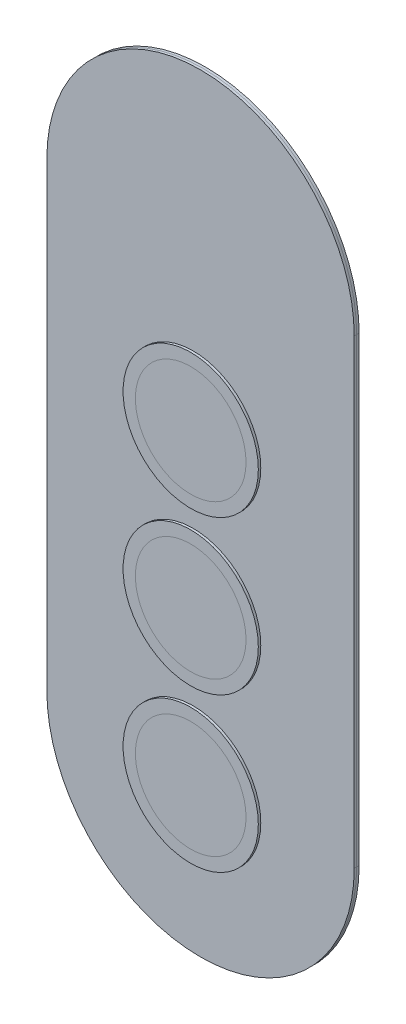
ISO-10303-21;
HEADER;
FILE_DESCRIPTION(('STEP AP214'),'2;1');
FILE_NAME('part.step','',(''),(''),'','','');
FILE_SCHEMA(('AUTOMOTIVE_DESIGN { 1 0 10303 214 1 1 1 1 }'));
ENDSEC;
DATA;
#1=APPLICATION_CONTEXT('core data for automotive mechanical design processes');
#2=APPLICATION_PROTOCOL_DEFINITION('international standard','automotive_design',2000,#1);
#3=PRODUCT_CONTEXT('',#1,'mechanical');
#4=PRODUCT('Part','Part','',(#3));
#5=PRODUCT_RELATED_PRODUCT_CATEGORY('part','',(#4));
#6=PRODUCT_DEFINITION_FORMATION('','',#4);
#7=PRODUCT_DEFINITION_CONTEXT('part definition',#1,'design');
#8=PRODUCT_DEFINITION('design','',#6,#7);
#9=PRODUCT_DEFINITION_SHAPE('','',#8);
#10=(LENGTH_UNIT() NAMED_UNIT(*) SI_UNIT(.MILLI.,.METRE.));
#11=(NAMED_UNIT(*) PLANE_ANGLE_UNIT() SI_UNIT($,.RADIAN.));
#12=(NAMED_UNIT(*) SI_UNIT($,.STERADIAN.) SOLID_ANGLE_UNIT());
#13=UNCERTAINTY_MEASURE_WITH_UNIT(LENGTH_MEASURE(1.E-05),#10,'distance_accuracy_value','');
#14=(GEOMETRIC_REPRESENTATION_CONTEXT(3) GLOBAL_UNCERTAINTY_ASSIGNED_CONTEXT((#13)) GLOBAL_UNIT_ASSIGNED_CONTEXT((#10,
#11,#12)) REPRESENTATION_CONTEXT('',''));
#15=CARTESIAN_POINT('',(0.,0.,0.));
#16=DIRECTION('',(0.,0.,1.));
#17=DIRECTION('',(1.,0.,0.));
#18=AXIS2_PLACEMENT_3D('',#15,#16,#17);
#19=CARTESIAN_POINT('',(0.,-93.75,2.));
#20=DIRECTION('',(0.,0.,-1.));
#21=DIRECTION('',(-1.,0.,0.));
#22=AXIS2_PLACEMENT_3D('',#19,#20,#21);
#23=CYLINDRICAL_SURFACE('',#22,62.5);
#24=CARTESIAN_POINT('',(0.,-93.75,1.));
#25=DIRECTION('',(0.,0.,1.));
#26=DIRECTION('',(1.,0.,0.));
#27=AXIS2_PLACEMENT_3D('',#24,#25,#26);
#28=CIRCLE('',#27,62.5);
#29=CARTESIAN_POINT('',(-62.5,-93.75,1.));
#30=VERTEX_POINT('',#29);
#31=CARTESIAN_POINT('',(62.5,-93.75,1.));
#32=VERTEX_POINT('',#31);
#33=EDGE_CURVE('E109',#30,#32,#28,.T.);
#34=ORIENTED_EDGE('',*,*,#33,.T.);
#35=DIRECTION('',(0.,0.,-1.));
#36=VECTOR('',#35,1.);
#37=CARTESIAN_POINT('',(62.5,-93.75,2.));
#38=LINE('',#37,#36);
#39=CARTESIAN_POINT('',(62.5,-93.75,2.));
#40=VERTEX_POINT('',#39);
#41=EDGE_CURVE('E12',#40,#32,#38,.T.);
#42=ORIENTED_EDGE('',*,*,#41,.F.);
#43=CARTESIAN_POINT('',(0.,-93.75,2.));
#44=DIRECTION('',(0.,0.,1.));
#45=DIRECTION('',(1.,0.,0.));
#46=AXIS2_PLACEMENT_3D('',#43,#44,#45);
#47=CIRCLE('',#46,62.5);
#48=CARTESIAN_POINT('',(-62.5,-93.75,2.));
#49=VERTEX_POINT('',#48);
#50=EDGE_CURVE('E97',#49,#40,#47,.T.);
#51=ORIENTED_EDGE('',*,*,#50,.F.);
#52=DIRECTION('',(0.,0.,-1.));
#53=VECTOR('',#52,1.);
#54=CARTESIAN_POINT('',(-62.5,-93.75,2.));
#55=LINE('',#54,#53);
#56=EDGE_CURVE('E105',#49,#30,#55,.T.);
#57=ORIENTED_EDGE('',*,*,#56,.T.);
#58=EDGE_LOOP('',(#34,#42,#51,#57));
#59=FACE_BOUND('',#58,.T.);
#60=ADVANCED_FACE('F46',(#59),#23,.T.);
#61=CARTESIAN_POINT('',(62.5,-93.75,2.));
#62=DIRECTION('',(-1.,0.,0.));
#63=DIRECTION('',(0.,0.,1.));
#64=AXIS2_PLACEMENT_3D('',#61,#62,#63);
#65=PLANE('',#64);
#66=DIRECTION('',(0.,1.,0.));
#67=VECTOR('',#66,1.);
#68=CARTESIAN_POINT('',(62.5,-93.75,1.));
#69=LINE('',#68,#67);
#70=CARTESIAN_POINT('',(62.5,93.75,1.));
#71=VERTEX_POINT('',#70);
#72=EDGE_CURVE('E101',#32,#71,#69,.T.);
#73=ORIENTED_EDGE('',*,*,#72,.T.);
#74=DIRECTION('',(0.,0.,-1.));
#75=VECTOR('',#74,1.);
#76=CARTESIAN_POINT('',(62.5,93.75,2.));
#77=LINE('',#76,#75);
#78=CARTESIAN_POINT('',(62.5,93.75,2.));
#79=VERTEX_POINT('',#78);
#80=EDGE_CURVE('E54',#79,#71,#77,.T.);
#81=ORIENTED_EDGE('',*,*,#80,.F.);
#82=DIRECTION('',(0.,1.,0.));
#83=VECTOR('',#82,1.);
#84=CARTESIAN_POINT('',(62.5,-93.75,2.));
#85=LINE('',#84,#83);
#86=EDGE_CURVE('E92',#40,#79,#85,.T.);
#87=ORIENTED_EDGE('',*,*,#86,.F.);
#88=ORIENTED_EDGE('',*,*,#41,.T.);
#89=EDGE_LOOP('',(#73,#81,#87,#88));
#90=FACE_BOUND('',#89,.T.);
#91=ADVANCED_FACE('F100',(#90),#65,.F.);
#92=CARTESIAN_POINT('',(0.,93.75,2.));
#93=DIRECTION('',(0.,0.,-1.));
#94=DIRECTION('',(-1.,0.,0.));
#95=AXIS2_PLACEMENT_3D('',#92,#93,#94);
#96=CYLINDRICAL_SURFACE('',#95,62.5);
#97=CARTESIAN_POINT('',(0.,93.75,1.));
#98=DIRECTION('',(0.,0.,1.));
#99=DIRECTION('',(1.,0.,0.));
#100=AXIS2_PLACEMENT_3D('',#97,#98,#99);
#101=CIRCLE('',#100,62.5);
#102=CARTESIAN_POINT('',(-62.5,93.75,1.));
#103=VERTEX_POINT('',#102);
#104=EDGE_CURVE('E79',#71,#103,#101,.T.);
#105=ORIENTED_EDGE('',*,*,#104,.T.);
#106=DIRECTION('',(0.,0.,-1.));
#107=VECTOR('',#106,1.);
#108=CARTESIAN_POINT('',(-62.5,93.75,2.));
#109=LINE('',#108,#107);
#110=CARTESIAN_POINT('',(-62.5,93.75,2.));
#111=VERTEX_POINT('',#110);
#112=EDGE_CURVE('E102',#111,#103,#109,.T.);
#113=ORIENTED_EDGE('',*,*,#112,.F.);
#114=CARTESIAN_POINT('',(0.,93.75,2.));
#115=DIRECTION('',(0.,0.,1.));
#116=DIRECTION('',(1.,0.,0.));
#117=AXIS2_PLACEMENT_3D('',#114,#115,#116);
#118=CIRCLE('',#117,62.5);
#119=EDGE_CURVE('E95',#79,#111,#118,.T.);
#120=ORIENTED_EDGE('',*,*,#119,.F.);
#121=ORIENTED_EDGE('',*,*,#80,.T.);
#122=EDGE_LOOP('',(#105,#113,#120,#121));
#123=FACE_BOUND('',#122,.T.);
#124=ADVANCED_FACE('F103',(#123),#96,.T.);
#125=CARTESIAN_POINT('',(-62.5,93.75,2.));
#126=DIRECTION('',(1.,0.,0.));
#127=DIRECTION('',(0.,1.,0.));
#128=AXIS2_PLACEMENT_3D('',#125,#126,#127);
#129=PLANE('',#128);
#130=DIRECTION('',(0.,-1.,0.));
#131=VECTOR('',#130,1.);
#132=CARTESIAN_POINT('',(-62.5,93.75,1.));
#133=LINE('',#132,#131);
#134=EDGE_CURVE('E85',#103,#30,#133,.T.);
#135=ORIENTED_EDGE('',*,*,#134,.T.);
#136=ORIENTED_EDGE('',*,*,#56,.F.);
#137=DIRECTION('',(0.,-1.,0.));
#138=VECTOR('',#137,1.);
#139=CARTESIAN_POINT('',(-62.5,93.75,2.));
#140=LINE('',#139,#138);
#141=EDGE_CURVE('E62',#111,#49,#140,.T.);
#142=ORIENTED_EDGE('',*,*,#141,.F.);
#143=ORIENTED_EDGE('',*,*,#112,.T.);
#144=EDGE_LOOP('',(#135,#136,#142,#143));
#145=FACE_BOUND('',#144,.T.);
#146=ADVANCED_FACE('F116',(#145),#129,.F.);
#147=CARTESIAN_POINT('',(0.,-93.75,2.));
#148=DIRECTION('',(0.,0.,1.));
#149=DIRECTION('',(1.,0.,0.));
#150=AXIS2_PLACEMENT_3D('',#147,#148,#149);
#151=PLANE('',#150);
#152=ORIENTED_EDGE('',*,*,#50,.T.);
#153=ORIENTED_EDGE('',*,*,#86,.T.);
#154=ORIENTED_EDGE('',*,*,#119,.T.);
#155=ORIENTED_EDGE('',*,*,#141,.T.);
#156=EDGE_LOOP('',(#152,#153,#154,#155));
#157=FACE_BOUND('',#156,.T.);
#158=ADVANCED_FACE('F93',(#157),#151,.T.);
#159=CARTESIAN_POINT('',(0.,-93.75,1.));
#160=DIRECTION('',(0.,0.,1.));
#161=DIRECTION('',(1.,0.,0.));
#162=AXIS2_PLACEMENT_3D('',#159,#160,#161);
#163=PLANE('',#162);
#164=ORIENTED_EDGE('',*,*,#33,.F.);
#165=ORIENTED_EDGE('',*,*,#134,.F.);
#166=ORIENTED_EDGE('',*,*,#104,.F.);
#167=ORIENTED_EDGE('',*,*,#72,.F.);
#168=EDGE_LOOP('',(#164,#165,#166,#167));
#169=FACE_BOUND('',#168,.T.);
#170=ADVANCED_FACE('F119',(#169),#163,.F.);
#171=CLOSED_SHELL('',(#60,#91,#124,#146,#158,#170));
#172=MANIFOLD_SOLID_BREP('B2',#171);
#173=CARTESIAN_POINT('',(0.,31.25,6.));
#174=DIRECTION('',(0.,0.,-1.));
#175=DIRECTION('',(-1.,0.,0.));
#176=AXIS2_PLACEMENT_3D('',#173,#174,#175);
#177=CYLINDRICAL_SURFACE('',#176,22.5);
#178=CARTESIAN_POINT('',(0.,31.25,6.));
#179=DIRECTION('',(0.,0.,1.));
#180=DIRECTION('',(1.,0.,0.));
#181=AXIS2_PLACEMENT_3D('',#178,#179,#180);
#182=CIRCLE('',#181,22.5);
#183=CARTESIAN_POINT('',(22.5,31.25,6.));
#184=VERTEX_POINT('',#183);
#185=EDGE_CURVE('E45',#184,#184,#182,.T.);
#186=ORIENTED_EDGE('',*,*,#185,.F.);
#187=EDGE_LOOP('',(#186));
#188=FACE_BOUND('',#187,.T.);
#189=CARTESIAN_POINT('',(0.,31.25,5.));
#190=DIRECTION('',(0.,0.,1.));
#191=DIRECTION('',(1.,0.,0.));
#192=AXIS2_PLACEMENT_3D('',#189,#190,#191);
#193=CIRCLE('',#192,22.5);
#194=CARTESIAN_POINT('',(22.5,31.25,5.));
#195=VERTEX_POINT('',#194);
#196=EDGE_CURVE('E181',#195,#195,#193,.T.);
#197=ORIENTED_EDGE('',*,*,#196,.T.);
#198=EDGE_LOOP('',(#197));
#199=FACE_BOUND('',#198,.T.);
#200=ADVANCED_FACE('F178',(#188,#199),#177,.T.);
#201=CARTESIAN_POINT('',(0.,31.25,6.));
#202=DIRECTION('',(0.,0.,1.));
#203=DIRECTION('',(1.,0.,0.));
#204=AXIS2_PLACEMENT_3D('',#201,#202,#203);
#205=PLANE('',#204);
#206=ORIENTED_EDGE('',*,*,#185,.T.);
#207=EDGE_LOOP('',(#206));
#208=FACE_BOUND('',#207,.T.);
#209=ADVANCED_FACE('F193',(#208),#205,.T.);
#210=CARTESIAN_POINT('',(0.,31.25,5.));
#211=DIRECTION('',(0.,0.,1.));
#212=DIRECTION('',(1.,0.,0.));
#213=AXIS2_PLACEMENT_3D('',#210,#211,#212);
#214=PLANE('',#213);
#215=ORIENTED_EDGE('',*,*,#196,.F.);
#216=EDGE_LOOP('',(#215));
#217=FACE_BOUND('',#216,.T.);
#218=ADVANCED_FACE('F191',(#217),#214,.F.);
#219=CLOSED_SHELL('',(#200,#209,#218));
#220=MANIFOLD_SOLID_BREP('B6_NOT_SHOWN',#219);
#221=CARTESIAN_POINT('',(0.,-31.25,6.));
#222=DIRECTION('',(0.,0.,-1.));
#223=DIRECTION('',(-1.,0.,0.));
#224=AXIS2_PLACEMENT_3D('',#221,#222,#223);
#225=CYLINDRICAL_SURFACE('',#224,22.5);
#226=CARTESIAN_POINT('',(0.,-31.25,6.));
#227=DIRECTION('',(0.,0.,1.));
#228=DIRECTION('',(1.,0.,0.));
#229=AXIS2_PLACEMENT_3D('',#226,#227,#228);
#230=CIRCLE('',#229,22.5);
#231=CARTESIAN_POINT('',(22.5,-31.25,6.));
#232=VERTEX_POINT('',#231);
#233=EDGE_CURVE('E177',#232,#232,#230,.T.);
#234=ORIENTED_EDGE('',*,*,#233,.F.);
#235=EDGE_LOOP('',(#234));
#236=FACE_BOUND('',#235,.T.);
#237=CARTESIAN_POINT('',(0.,-31.25,5.));
#238=DIRECTION('',(0.,0.,1.));
#239=DIRECTION('',(1.,0.,0.));
#240=AXIS2_PLACEMENT_3D('',#237,#238,#239);
#241=CIRCLE('',#240,22.5);
#242=CARTESIAN_POINT('',(22.5,-31.25,5.));
#243=VERTEX_POINT('',#242);
#244=EDGE_CURVE('E230',#243,#243,#241,.T.);
#245=ORIENTED_EDGE('',*,*,#244,.T.);
#246=EDGE_LOOP('',(#245));
#247=FACE_BOUND('',#246,.T.);
#248=ADVANCED_FACE('F227',(#236,#247),#225,.T.);
#249=CARTESIAN_POINT('',(0.,-31.25,6.));
#250=DIRECTION('',(0.,0.,1.));
#251=DIRECTION('',(1.,0.,0.));
#252=AXIS2_PLACEMENT_3D('',#249,#250,#251);
#253=PLANE('',#252);
#254=ORIENTED_EDGE('',*,*,#233,.T.);
#255=EDGE_LOOP('',(#254));
#256=FACE_BOUND('',#255,.T.);
#257=ADVANCED_FACE('F242',(#256),#253,.T.);
#258=CARTESIAN_POINT('',(0.,-31.25,5.));
#259=DIRECTION('',(0.,0.,1.));
#260=DIRECTION('',(1.,0.,0.));
#261=AXIS2_PLACEMENT_3D('',#258,#259,#260);
#262=PLANE('',#261);
#263=ORIENTED_EDGE('',*,*,#244,.F.);
#264=EDGE_LOOP('',(#263));
#265=FACE_BOUND('',#264,.T.);
#266=ADVANCED_FACE('F240',(#265),#262,.F.);
#267=CLOSED_SHELL('',(#248,#257,#266));
#268=MANIFOLD_SOLID_BREP('B40_NOT_SHOWN',#267);
#269=CARTESIAN_POINT('',(0.,-93.75,6.));
#270=DIRECTION('',(0.,0.,-1.));
#271=DIRECTION('',(-1.,0.,0.));
#272=AXIS2_PLACEMENT_3D('',#269,#270,#271);
#273=CYLINDRICAL_SURFACE('',#272,22.5);
#274=CARTESIAN_POINT('',(0.,-93.75,6.));
#275=DIRECTION('',(0.,0.,1.));
#276=DIRECTION('',(1.,0.,0.));
#277=AXIS2_PLACEMENT_3D('',#274,#275,#276);
#278=CIRCLE('',#277,22.5);
#279=CARTESIAN_POINT('',(22.5,-93.75,6.));
#280=VERTEX_POINT('',#279);
#281=EDGE_CURVE('E226',#280,#280,#278,.T.);
#282=ORIENTED_EDGE('',*,*,#281,.F.);
#283=EDGE_LOOP('',(#282));
#284=FACE_BOUND('',#283,.T.);
#285=CARTESIAN_POINT('',(0.,-93.75,5.));
#286=DIRECTION('',(0.,0.,1.));
#287=DIRECTION('',(1.,0.,0.));
#288=AXIS2_PLACEMENT_3D('',#285,#286,#287);
#289=CIRCLE('',#288,22.5);
#290=CARTESIAN_POINT('',(22.5,-93.75,5.));
#291=VERTEX_POINT('',#290);
#292=EDGE_CURVE('E279',#291,#291,#289,.T.);
#293=ORIENTED_EDGE('',*,*,#292,.T.);
#294=EDGE_LOOP('',(#293));
#295=FACE_BOUND('',#294,.T.);
#296=ADVANCED_FACE('F276',(#284,#295),#273,.T.);
#297=CARTESIAN_POINT('',(0.,-93.75,6.));
#298=DIRECTION('',(0.,0.,1.));
#299=DIRECTION('',(1.,0.,0.));
#300=AXIS2_PLACEMENT_3D('',#297,#298,#299);
#301=PLANE('',#300);
#302=ORIENTED_EDGE('',*,*,#281,.T.);
#303=EDGE_LOOP('',(#302));
#304=FACE_BOUND('',#303,.T.);
#305=ADVANCED_FACE('F291',(#304),#301,.T.);
#306=CARTESIAN_POINT('',(0.,-93.75,5.));
#307=DIRECTION('',(0.,0.,1.));
#308=DIRECTION('',(1.,0.,0.));
#309=AXIS2_PLACEMENT_3D('',#306,#307,#308);
#310=PLANE('',#309);
#311=ORIENTED_EDGE('',*,*,#292,.F.);
#312=EDGE_LOOP('',(#311));
#313=FACE_BOUND('',#312,.T.);
#314=ADVANCED_FACE('F289',(#313),#310,.F.);
#315=CLOSED_SHELL('',(#296,#305,#314));
#316=MANIFOLD_SOLID_BREP('B172_NOT_SHOWN',#315);
#317=CARTESIAN_POINT('',(0.,-93.75,6.));
#318=DIRECTION('',(0.,0.,1.));
#319=DIRECTION('',(1.,0.,0.));
#320=AXIS2_PLACEMENT_3D('',#317,#318,#319);
#321=PLANE('',#320);
#322=CARTESIAN_POINT('',(0.,-93.75,6.));
#323=DIRECTION('',(0.,0.,1.));
#324=DIRECTION('',(1.,0.,0.));
#325=AXIS2_PLACEMENT_3D('',#322,#323,#324);
#326=CIRCLE('',#325,27.5);
#327=CARTESIAN_POINT('',(27.5,-93.75,6.));
#328=VERTEX_POINT('',#327);
#329=EDGE_CURVE('E275',#328,#328,#326,.T.);
#330=ORIENTED_EDGE('',*,*,#329,.T.);
#331=EDGE_LOOP('',(#330));
#332=FACE_BOUND('',#331,.T.);
#333=CARTESIAN_POINT('',(0.,-93.75,6.));
#334=DIRECTION('',(0.,0.,1.));
#335=DIRECTION('',(1.,0.,0.));
#336=AXIS2_PLACEMENT_3D('',#333,#334,#335);
#337=CIRCLE('',#336,22.5);
#338=CARTESIAN_POINT('',(22.5,-93.75,6.));
#339=VERTEX_POINT('',#338);
#340=EDGE_CURVE('E336',#339,#339,#337,.T.);
#341=ORIENTED_EDGE('',*,*,#340,.F.);
#342=EDGE_LOOP('',(#341));
#343=FACE_BOUND('',#342,.T.);
#344=ADVANCED_FACE('F325',(#332,#343),#321,.T.);
#345=CARTESIAN_POINT('',(0.,-93.75,5.));
#346=DIRECTION('',(0.,0.,1.));
#347=DIRECTION('',(1.,0.,0.));
#348=AXIS2_PLACEMENT_3D('',#345,#346,#347);
#349=PLANE('',#348);
#350=CARTESIAN_POINT('',(0.,-93.75,5.));
#351=DIRECTION('',(0.,0.,1.));
#352=DIRECTION('',(1.,0.,0.));
#353=AXIS2_PLACEMENT_3D('',#350,#351,#352);
#354=CIRCLE('',#353,27.5);
#355=CARTESIAN_POINT('',(27.5,-93.75,5.));
#356=VERTEX_POINT('',#355);
#357=EDGE_CURVE('E329',#356,#356,#354,.T.);
#358=ORIENTED_EDGE('',*,*,#357,.F.);
#359=EDGE_LOOP('',(#358));
#360=FACE_BOUND('',#359,.T.);
#361=CARTESIAN_POINT('',(0.,-93.75,5.));
#362=DIRECTION('',(0.,0.,1.));
#363=DIRECTION('',(1.,0.,0.));
#364=AXIS2_PLACEMENT_3D('',#361,#362,#363);
#365=CIRCLE('',#364,22.5);
#366=CARTESIAN_POINT('',(22.5,-93.75,5.));
#367=VERTEX_POINT('',#366);
#368=EDGE_CURVE('E338',#367,#367,#365,.T.);
#369=ORIENTED_EDGE('',*,*,#368,.T.);
#370=EDGE_LOOP('',(#369));
#371=FACE_BOUND('',#370,.T.);
#372=ADVANCED_FACE('F348',(#360,#371),#349,.F.);
#373=CARTESIAN_POINT('',(0.,-93.75,6.));
#374=DIRECTION('',(0.,0.,-1.));
#375=DIRECTION('',(-1.,0.,0.));
#376=AXIS2_PLACEMENT_3D('',#373,#374,#375);
#377=CYLINDRICAL_SURFACE('',#376,27.5);
#378=ORIENTED_EDGE('',*,*,#329,.F.);
#379=EDGE_LOOP('',(#378));
#380=FACE_BOUND('',#379,.T.);
#381=ORIENTED_EDGE('',*,*,#357,.T.);
#382=EDGE_LOOP('',(#381));
#383=FACE_BOUND('',#382,.T.);
#384=ADVANCED_FACE('F327',(#380,#383),#377,.T.);
#385=CARTESIAN_POINT('',(0.,-93.75,6.));
#386=DIRECTION('',(0.,0.,-1.));
#387=DIRECTION('',(-1.,0.,0.));
#388=AXIS2_PLACEMENT_3D('',#385,#386,#387);
#389=CYLINDRICAL_SURFACE('',#388,22.5);
#390=ORIENTED_EDGE('',*,*,#340,.T.);
#391=EDGE_LOOP('',(#390));
#392=FACE_BOUND('',#391,.T.);
#393=ORIENTED_EDGE('',*,*,#368,.F.);
#394=EDGE_LOOP('',(#393));
#395=FACE_BOUND('',#394,.T.);
#396=ADVANCED_FACE('F344',(#392,#395),#389,.F.);
#397=CLOSED_SHELL('',(#344,#372,#384,#396));
#398=MANIFOLD_SOLID_BREP('B221_NOT_SHOWN',#397);
#399=CARTESIAN_POINT('',(0.,-31.25,6.));
#400=DIRECTION('',(0.,0.,1.));
#401=DIRECTION('',(1.,0.,0.));
#402=AXIS2_PLACEMENT_3D('',#399,#400,#401);
#403=PLANE('',#402);
#404=CARTESIAN_POINT('',(0.,-31.25,6.));
#405=DIRECTION('',(0.,0.,1.));
#406=DIRECTION('',(1.,0.,0.));
#407=AXIS2_PLACEMENT_3D('',#404,#405,#406);
#408=CIRCLE('',#407,27.5);
#409=CARTESIAN_POINT('',(27.5,-31.25,6.));
#410=VERTEX_POINT('',#409);
#411=EDGE_CURVE('E324',#410,#410,#408,.T.);
#412=ORIENTED_EDGE('',*,*,#411,.T.);
#413=EDGE_LOOP('',(#412));
#414=FACE_BOUND('',#413,.T.);
#415=CARTESIAN_POINT('',(0.,-31.25,6.));
#416=DIRECTION('',(0.,0.,1.));
#417=DIRECTION('',(1.,0.,0.));
#418=AXIS2_PLACEMENT_3D('',#415,#416,#417);
#419=CIRCLE('',#418,22.5);
#420=CARTESIAN_POINT('',(22.5,-31.25,6.));
#421=VERTEX_POINT('',#420);
#422=EDGE_CURVE('E406',#421,#421,#419,.T.);
#423=ORIENTED_EDGE('',*,*,#422,.F.);
#424=EDGE_LOOP('',(#423));
#425=FACE_BOUND('',#424,.T.);
#426=ADVANCED_FACE('F395',(#414,#425),#403,.T.);
#427=CARTESIAN_POINT('',(0.,-31.25,5.));
#428=DIRECTION('',(0.,0.,1.));
#429=DIRECTION('',(1.,0.,0.));
#430=AXIS2_PLACEMENT_3D('',#427,#428,#429);
#431=PLANE('',#430);
#432=CARTESIAN_POINT('',(0.,-31.25,5.));
#433=DIRECTION('',(0.,0.,1.));
#434=DIRECTION('',(1.,0.,0.));
#435=AXIS2_PLACEMENT_3D('',#432,#433,#434);
#436=CIRCLE('',#435,27.5);
#437=CARTESIAN_POINT('',(27.5,-31.25,5.));
#438=VERTEX_POINT('',#437);
#439=EDGE_CURVE('E399',#438,#438,#436,.T.);
#440=ORIENTED_EDGE('',*,*,#439,.F.);
#441=EDGE_LOOP('',(#440));
#442=FACE_BOUND('',#441,.T.);
#443=CARTESIAN_POINT('',(0.,-31.25,5.));
#444=DIRECTION('',(0.,0.,1.));
#445=DIRECTION('',(1.,0.,0.));
#446=AXIS2_PLACEMENT_3D('',#443,#444,#445);
#447=CIRCLE('',#446,22.5);
#448=CARTESIAN_POINT('',(22.5,-31.25,5.));
#449=VERTEX_POINT('',#448);
#450=EDGE_CURVE('E408',#449,#449,#447,.T.);
#451=ORIENTED_EDGE('',*,*,#450,.T.);
#452=EDGE_LOOP('',(#451));
#453=FACE_BOUND('',#452,.T.);
#454=ADVANCED_FACE('F418',(#442,#453),#431,.F.);
#455=CARTESIAN_POINT('',(0.,-31.25,6.));
#456=DIRECTION('',(0.,0.,-1.));
#457=DIRECTION('',(-1.,0.,0.));
#458=AXIS2_PLACEMENT_3D('',#455,#456,#457);
#459=CYLINDRICAL_SURFACE('',#458,27.5);
#460=ORIENTED_EDGE('',*,*,#411,.F.);
#461=EDGE_LOOP('',(#460));
#462=FACE_BOUND('',#461,.T.);
#463=ORIENTED_EDGE('',*,*,#439,.T.);
#464=EDGE_LOOP('',(#463));
#465=FACE_BOUND('',#464,.T.);
#466=ADVANCED_FACE('F397',(#462,#465),#459,.T.);
#467=CARTESIAN_POINT('',(0.,-31.25,6.));
#468=DIRECTION('',(0.,0.,-1.));
#469=DIRECTION('',(-1.,0.,0.));
#470=AXIS2_PLACEMENT_3D('',#467,#468,#469);
#471=CYLINDRICAL_SURFACE('',#470,22.5);
#472=ORIENTED_EDGE('',*,*,#422,.T.);
#473=EDGE_LOOP('',(#472));
#474=FACE_BOUND('',#473,.T.);
#475=ORIENTED_EDGE('',*,*,#450,.F.);
#476=EDGE_LOOP('',(#475));
#477=FACE_BOUND('',#476,.T.);
#478=ADVANCED_FACE('F414',(#474,#477),#471,.F.);
#479=CLOSED_SHELL('',(#426,#454,#466,#478));
#480=MANIFOLD_SOLID_BREP('B270_NOT_SHOWN',#479);
#481=CARTESIAN_POINT('',(0.,31.25,6.));
#482=DIRECTION('',(0.,0.,1.));
#483=DIRECTION('',(1.,0.,0.));
#484=AXIS2_PLACEMENT_3D('',#481,#482,#483);
#485=PLANE('',#484);
#486=CARTESIAN_POINT('',(0.,31.25,6.));
#487=DIRECTION('',(0.,0.,1.));
#488=DIRECTION('',(1.,0.,0.));
#489=AXIS2_PLACEMENT_3D('',#486,#487,#488);
#490=CIRCLE('',#489,27.5);
#491=CARTESIAN_POINT('',(27.5,31.25,6.));
#492=VERTEX_POINT('',#491);
#493=EDGE_CURVE('E394',#492,#492,#490,.T.);
#494=ORIENTED_EDGE('',*,*,#493,.T.);
#495=EDGE_LOOP('',(#494));
#496=FACE_BOUND('',#495,.T.);
#497=CARTESIAN_POINT('',(0.,31.25,6.));
#498=DIRECTION('',(0.,0.,1.));
#499=DIRECTION('',(1.,0.,0.));
#500=AXIS2_PLACEMENT_3D('',#497,#498,#499);
#501=CIRCLE('',#500,22.5);
#502=CARTESIAN_POINT('',(22.5,31.25,6.));
#503=VERTEX_POINT('',#502);
#504=EDGE_CURVE('E477',#503,#503,#501,.T.);
#505=ORIENTED_EDGE('',*,*,#504,.F.);
#506=EDGE_LOOP('',(#505));
#507=FACE_BOUND('',#506,.T.);
#508=ADVANCED_FACE('F466',(#496,#507),#485,.T.);
#509=CARTESIAN_POINT('',(0.,31.25,5.));
#510=DIRECTION('',(0.,0.,1.));
#511=DIRECTION('',(1.,0.,0.));
#512=AXIS2_PLACEMENT_3D('',#509,#510,#511);
#513=PLANE('',#512);
#514=CARTESIAN_POINT('',(0.,31.25,5.));
#515=DIRECTION('',(0.,0.,1.));
#516=DIRECTION('',(1.,0.,0.));
#517=AXIS2_PLACEMENT_3D('',#514,#515,#516);
#518=CIRCLE('',#517,27.5);
#519=CARTESIAN_POINT('',(27.5,31.25,5.));
#520=VERTEX_POINT('',#519);
#521=EDGE_CURVE('E470',#520,#520,#518,.T.);
#522=ORIENTED_EDGE('',*,*,#521,.F.);
#523=EDGE_LOOP('',(#522));
#524=FACE_BOUND('',#523,.T.);
#525=CARTESIAN_POINT('',(0.,31.25,5.));
#526=DIRECTION('',(0.,0.,1.));
#527=DIRECTION('',(1.,0.,0.));
#528=AXIS2_PLACEMENT_3D('',#525,#526,#527);
#529=CIRCLE('',#528,22.5);
#530=CARTESIAN_POINT('',(22.5,31.25,5.));
#531=VERTEX_POINT('',#530);
#532=EDGE_CURVE('E479',#531,#531,#529,.T.);
#533=ORIENTED_EDGE('',*,*,#532,.T.);
#534=EDGE_LOOP('',(#533));
#535=FACE_BOUND('',#534,.T.);
#536=ADVANCED_FACE('F489',(#524,#535),#513,.F.);
#537=CARTESIAN_POINT('',(0.,31.25,6.));
#538=DIRECTION('',(0.,0.,-1.));
#539=DIRECTION('',(-1.,0.,0.));
#540=AXIS2_PLACEMENT_3D('',#537,#538,#539);
#541=CYLINDRICAL_SURFACE('',#540,27.5);
#542=ORIENTED_EDGE('',*,*,#493,.F.);
#543=EDGE_LOOP('',(#542));
#544=FACE_BOUND('',#543,.T.);
#545=ORIENTED_EDGE('',*,*,#521,.T.);
#546=EDGE_LOOP('',(#545));
#547=FACE_BOUND('',#546,.T.);
#548=ADVANCED_FACE('F468',(#544,#547),#541,.T.);
#549=CARTESIAN_POINT('',(0.,31.25,6.));
#550=DIRECTION('',(0.,0.,-1.));
#551=DIRECTION('',(-1.,0.,0.));
#552=AXIS2_PLACEMENT_3D('',#549,#550,#551);
#553=CYLINDRICAL_SURFACE('',#552,22.5);
#554=ORIENTED_EDGE('',*,*,#504,.T.);
#555=EDGE_LOOP('',(#554));
#556=FACE_BOUND('',#555,.T.);
#557=ORIENTED_EDGE('',*,*,#532,.F.);
#558=EDGE_LOOP('',(#557));
#559=FACE_BOUND('',#558,.T.);
#560=ADVANCED_FACE('F485',(#556,#559),#553,.F.);
#561=CLOSED_SHELL('',(#508,#536,#548,#560));
#562=MANIFOLD_SOLID_BREP('B319_NOT_SHOWN',#561);
#563=CARTESIAN_POINT('',(0.,-93.75,1.));
#564=DIRECTION('',(0.,0.,1.));
#565=DIRECTION('',(1.,0.,0.));
#566=AXIS2_PLACEMENT_3D('',#563,#564,#565);
#567=PLANE('',#566);
#568=CARTESIAN_POINT('',(0.,-93.75,1.));
#569=DIRECTION('',(0.,0.,1.));
#570=DIRECTION('',(1.,0.,0.));
#571=AXIS2_PLACEMENT_3D('',#568,#569,#570);
#572=CIRCLE('',#571,25.);
#573=CARTESIAN_POINT('',(25.,-93.75,1.));
#574=VERTEX_POINT('',#573);
#575=EDGE_CURVE('E610',#574,#574,#572,.T.);
#576=ORIENTED_EDGE('',*,*,#575,.F.);
#577=EDGE_LOOP('',(#576));
#578=FACE_BOUND('',#577,.T.);
#579=CARTESIAN_POINT('',(0.,-93.75,1.));
#580=DIRECTION('',(0.,0.,1.));
#581=DIRECTION('',(1.,0.,0.));
#582=AXIS2_PLACEMENT_3D('',#579,#580,#581);
#583=CIRCLE('',#582,62.5);
#584=CARTESIAN_POINT('',(-62.5,-93.75,1.));
#585=VERTEX_POINT('',#584);
#586=CARTESIAN_POINT('',(62.5,-93.75,1.));
#587=VERTEX_POINT('',#586);
#588=EDGE_CURVE('E580',#585,#587,#583,.T.);
#589=ORIENTED_EDGE('',*,*,#588,.T.);
#590=DIRECTION('',(0.,1.,0.));
#591=VECTOR('',#590,1.);
#592=CARTESIAN_POINT('',(62.5,-93.75,1.));
#593=LINE('',#592,#591);
#594=CARTESIAN_POINT('',(62.5,93.75,1.));
#595=VERTEX_POINT('',#594);
#596=EDGE_CURVE('E575',#587,#595,#593,.T.);
#597=ORIENTED_EDGE('',*,*,#596,.T.);
#598=CARTESIAN_POINT('',(0.,93.75,1.));
#599=DIRECTION('',(0.,0.,1.));
#600=DIRECTION('',(1.,0.,0.));
#601=AXIS2_PLACEMENT_3D('',#598,#599,#600);
#602=CIRCLE('',#601,62.5);
#603=CARTESIAN_POINT('',(-62.5,93.75,1.));
#604=VERTEX_POINT('',#603);
#605=EDGE_CURVE('E578',#595,#604,#602,.T.);
#606=ORIENTED_EDGE('',*,*,#605,.T.);
#607=DIRECTION('',(0.,-1.,0.));
#608=VECTOR('',#607,1.);
#609=CARTESIAN_POINT('',(-62.5,-93.75,1.));
#610=LINE('',#609,#608);
#611=EDGE_CURVE('E545',#604,#585,#610,.T.);
#612=ORIENTED_EDGE('',*,*,#611,.T.);
#613=EDGE_LOOP('',(#589,#597,#606,#612));
#614=FACE_BOUND('',#613,.T.);
#615=CARTESIAN_POINT('',(0.,-31.25,1.));
#616=DIRECTION('',(0.,0.,1.));
#617=DIRECTION('',(1.,0.,0.));
#618=AXIS2_PLACEMENT_3D('',#615,#616,#617);
#619=CIRCLE('',#618,25.);
#620=CARTESIAN_POINT('',(25.,-31.25,1.));
#621=VERTEX_POINT('',#620);
#622=EDGE_CURVE('E595',#621,#621,#619,.T.);
#623=ORIENTED_EDGE('',*,*,#622,.F.);
#624=EDGE_LOOP('',(#623));
#625=FACE_BOUND('',#624,.T.);
#626=CARTESIAN_POINT('',(0.,31.25,1.));
#627=DIRECTION('',(0.,0.,1.));
#628=DIRECTION('',(1.,0.,0.));
#629=AXIS2_PLACEMENT_3D('',#626,#627,#628);
#630=CIRCLE('',#629,25.);
#631=CARTESIAN_POINT('',(25.,31.25,1.));
#632=VERTEX_POINT('',#631);
#633=EDGE_CURVE('E616',#632,#632,#630,.T.);
#634=ORIENTED_EDGE('',*,*,#633,.F.);
#635=EDGE_LOOP('',(#634));
#636=FACE_BOUND('',#635,.T.);
#637=ADVANCED_FACE('F528',(#578,#614,#625,#636),#567,.T.);
#638=CARTESIAN_POINT('',(0.,-93.75,0.));
#639=DIRECTION('',(0.,0.,1.));
#640=DIRECTION('',(1.,0.,0.));
#641=AXIS2_PLACEMENT_3D('',#638,#639,#640);
#642=PLANE('',#641);
#643=CARTESIAN_POINT('',(0.,-93.75,0.));
#644=DIRECTION('',(0.,0.,1.));
#645=DIRECTION('',(1.,0.,0.));
#646=AXIS2_PLACEMENT_3D('',#643,#644,#645);
#647=CIRCLE('',#646,62.5);
#648=CARTESIAN_POINT('',(-62.5,-93.75,0.));
#649=VERTEX_POINT('',#648);
#650=CARTESIAN_POINT('',(62.5,-93.75,0.));
#651=VERTEX_POINT('',#650);
#652=EDGE_CURVE('E592',#649,#651,#647,.T.);
#653=ORIENTED_EDGE('',*,*,#652,.F.);
#654=DIRECTION('',(0.,-1.,0.));
#655=VECTOR('',#654,1.);
#656=CARTESIAN_POINT('',(-62.5,-93.75,0.));
#657=LINE('',#656,#655);
#658=CARTESIAN_POINT('',(-62.5,93.75,0.));
#659=VERTEX_POINT('',#658);
#660=EDGE_CURVE('E568',#659,#649,#657,.T.);
#661=ORIENTED_EDGE('',*,*,#660,.F.);
#662=CARTESIAN_POINT('',(0.,93.75,0.));
#663=DIRECTION('',(0.,0.,1.));
#664=DIRECTION('',(1.,0.,0.));
#665=AXIS2_PLACEMENT_3D('',#662,#663,#664);
#666=CIRCLE('',#665,62.5);
#667=CARTESIAN_POINT('',(62.5,93.75,0.));
#668=VERTEX_POINT('',#667);
#669=EDGE_CURVE('E562',#668,#659,#666,.T.);
#670=ORIENTED_EDGE('',*,*,#669,.F.);
#671=DIRECTION('',(0.,1.,0.));
#672=VECTOR('',#671,1.);
#673=CARTESIAN_POINT('',(62.5,-93.75,0.));
#674=LINE('',#673,#672);
#675=EDGE_CURVE('E584',#651,#668,#674,.T.);
#676=ORIENTED_EDGE('',*,*,#675,.F.);
#677=EDGE_LOOP('',(#653,#661,#670,#676));
#678=FACE_BOUND('',#677,.T.);
#679=CARTESIAN_POINT('',(0.,-31.25,0.));
#680=DIRECTION('',(0.,0.,1.));
#681=DIRECTION('',(1.,0.,0.));
#682=AXIS2_PLACEMENT_3D('',#679,#680,#681);
#683=CIRCLE('',#682,25.);
#684=CARTESIAN_POINT('',(25.,-31.25,0.));
#685=VERTEX_POINT('',#684);
#686=EDGE_CURVE('E607',#685,#685,#683,.T.);
#687=ORIENTED_EDGE('',*,*,#686,.T.);
#688=EDGE_LOOP('',(#687));
#689=FACE_BOUND('',#688,.T.);
#690=CARTESIAN_POINT('',(0.,-93.75,0.));
#691=DIRECTION('',(0.,0.,1.));
#692=DIRECTION('',(1.,0.,0.));
#693=AXIS2_PLACEMENT_3D('',#690,#691,#692);
#694=CIRCLE('',#693,25.);
#695=CARTESIAN_POINT('',(25.,-93.75,0.));
#696=VERTEX_POINT('',#695);
#697=EDGE_CURVE('E613',#696,#696,#694,.T.);
#698=ORIENTED_EDGE('',*,*,#697,.T.);
#699=EDGE_LOOP('',(#698));
#700=FACE_BOUND('',#699,.T.);
#701=CARTESIAN_POINT('',(0.,31.25,0.));
#702=DIRECTION('',(0.,0.,1.));
#703=DIRECTION('',(1.,0.,0.));
#704=AXIS2_PLACEMENT_3D('',#701,#702,#703);
#705=CIRCLE('',#704,25.);
#706=CARTESIAN_POINT('',(25.,31.25,0.));
#707=VERTEX_POINT('',#706);
#708=EDGE_CURVE('E619',#707,#707,#705,.T.);
#709=ORIENTED_EDGE('',*,*,#708,.T.);
#710=EDGE_LOOP('',(#709));
#711=FACE_BOUND('',#710,.T.);
#712=ADVANCED_FACE('F603',(#678,#689,#700,#711),#642,.F.);
#713=CARTESIAN_POINT('',(0.,-93.75,1.));
#714=DIRECTION('',(0.,0.,-1.));
#715=DIRECTION('',(-1.,0.,0.));
#716=AXIS2_PLACEMENT_3D('',#713,#714,#715);
#717=CYLINDRICAL_SURFACE('',#716,62.5);
#718=ORIENTED_EDGE('',*,*,#652,.T.);
#719=DIRECTION('',(0.,0.,-1.));
#720=VECTOR('',#719,1.);
#721=CARTESIAN_POINT('',(62.5,-93.75,1.));
#722=LINE('',#721,#720);
#723=EDGE_CURVE('E464',#587,#651,#722,.T.);
#724=ORIENTED_EDGE('',*,*,#723,.F.);
#725=ORIENTED_EDGE('',*,*,#588,.F.);
#726=DIRECTION('',(0.,0.,-1.));
#727=VECTOR('',#726,1.);
#728=CARTESIAN_POINT('',(-62.5,-93.75,1.));
#729=LINE('',#728,#727);
#730=EDGE_CURVE('E588',#585,#649,#729,.T.);
#731=ORIENTED_EDGE('',*,*,#730,.T.);
#732=EDGE_LOOP('',(#718,#724,#725,#731));
#733=FACE_BOUND('',#732,.T.);
#734=ADVANCED_FACE('F530',(#733),#717,.T.);
#735=CARTESIAN_POINT('',(62.5,-93.75,1.));
#736=DIRECTION('',(-1.,0.,0.));
#737=DIRECTION('',(0.,-1.,0.));
#738=AXIS2_PLACEMENT_3D('',#735,#736,#737);
#739=PLANE('',#738);
#740=ORIENTED_EDGE('',*,*,#675,.T.);
#741=DIRECTION('',(0.,0.,-1.));
#742=VECTOR('',#741,1.);
#743=CARTESIAN_POINT('',(62.5,93.75,1.));
#744=LINE('',#743,#742);
#745=EDGE_CURVE('E537',#595,#668,#744,.T.);
#746=ORIENTED_EDGE('',*,*,#745,.F.);
#747=ORIENTED_EDGE('',*,*,#596,.F.);
#748=ORIENTED_EDGE('',*,*,#723,.T.);
#749=EDGE_LOOP('',(#740,#746,#747,#748));
#750=FACE_BOUND('',#749,.T.);
#751=ADVANCED_FACE('F583',(#750),#739,.F.);
#752=CARTESIAN_POINT('',(0.,93.75,1.));
#753=DIRECTION('',(0.,0.,-1.));
#754=DIRECTION('',(-1.,0.,0.));
#755=AXIS2_PLACEMENT_3D('',#752,#753,#754);
#756=CYLINDRICAL_SURFACE('',#755,62.5);
#757=ORIENTED_EDGE('',*,*,#669,.T.);
#758=DIRECTION('',(0.,0.,-1.));
#759=VECTOR('',#758,1.);
#760=CARTESIAN_POINT('',(-62.5,93.75,1.));
#761=LINE('',#760,#759);
#762=EDGE_CURVE('E585',#604,#659,#761,.T.);
#763=ORIENTED_EDGE('',*,*,#762,.F.);
#764=ORIENTED_EDGE('',*,*,#605,.F.);
#765=ORIENTED_EDGE('',*,*,#745,.T.);
#766=EDGE_LOOP('',(#757,#763,#764,#765));
#767=FACE_BOUND('',#766,.T.);
#768=ADVANCED_FACE('F586',(#767),#756,.T.);
#769=CARTESIAN_POINT('',(-62.5,-93.75,1.));
#770=DIRECTION('',(1.,0.,0.));
#771=DIRECTION('',(0.,1.,0.));
#772=AXIS2_PLACEMENT_3D('',#769,#770,#771);
#773=PLANE('',#772);
#774=ORIENTED_EDGE('',*,*,#660,.T.);
#775=ORIENTED_EDGE('',*,*,#730,.F.);
#776=ORIENTED_EDGE('',*,*,#611,.F.);
#777=ORIENTED_EDGE('',*,*,#762,.T.);
#778=EDGE_LOOP('',(#774,#775,#776,#777));
#779=FACE_BOUND('',#778,.T.);
#780=ADVANCED_FACE('F600',(#779),#773,.F.);
#781=CARTESIAN_POINT('',(0.,-31.25,1.));
#782=DIRECTION('',(0.,0.,-1.));
#783=DIRECTION('',(-1.,0.,0.));
#784=AXIS2_PLACEMENT_3D('',#781,#782,#783);
#785=CYLINDRICAL_SURFACE('',#784,25.);
#786=ORIENTED_EDGE('',*,*,#622,.T.);
#787=EDGE_LOOP('',(#786));
#788=FACE_BOUND('',#787,.T.);
#789=ORIENTED_EDGE('',*,*,#686,.F.);
#790=EDGE_LOOP('',(#789));
#791=FACE_BOUND('',#790,.T.);
#792=ADVANCED_FACE('F637',(#788,#791),#785,.F.);
#793=CARTESIAN_POINT('',(0.,-93.75,1.));
#794=DIRECTION('',(0.,0.,-1.));
#795=DIRECTION('',(-1.,0.,0.));
#796=AXIS2_PLACEMENT_3D('',#793,#794,#795);
#797=CYLINDRICAL_SURFACE('',#796,25.);
#798=ORIENTED_EDGE('',*,*,#575,.T.);
#799=EDGE_LOOP('',(#798));
#800=FACE_BOUND('',#799,.T.);
#801=ORIENTED_EDGE('',*,*,#697,.F.);
#802=EDGE_LOOP('',(#801));
#803=FACE_BOUND('',#802,.T.);
#804=ADVANCED_FACE('F683',(#800,#803),#797,.F.);
#805=CARTESIAN_POINT('',(0.,31.25,1.));
#806=DIRECTION('',(0.,0.,-1.));
#807=DIRECTION('',(-1.,0.,0.));
#808=AXIS2_PLACEMENT_3D('',#805,#806,#807);
#809=CYLINDRICAL_SURFACE('',#808,25.);
#810=ORIENTED_EDGE('',*,*,#633,.T.);
#811=EDGE_LOOP('',(#810));
#812=FACE_BOUND('',#811,.T.);
#813=ORIENTED_EDGE('',*,*,#708,.F.);
#814=EDGE_LOOP('',(#813));
#815=FACE_BOUND('',#814,.T.);
#816=ADVANCED_FACE('F625',(#812,#815),#809,.F.);
#817=CLOSED_SHELL('',(#637,#712,#734,#751,#768,#780,#792,#804,#816));
#818=MANIFOLD_SOLID_BREP('B389_NOT_SHOWN',#817);
#819=ADVANCED_BREP_SHAPE_REPRESENTATION('',(#18,#172,#220,#268,#316,#398,#480,#562,#818),#14);
#820=SHAPE_DEFINITION_REPRESENTATION(#9,#819);
ENDSEC;
END-ISO-10303-21;
